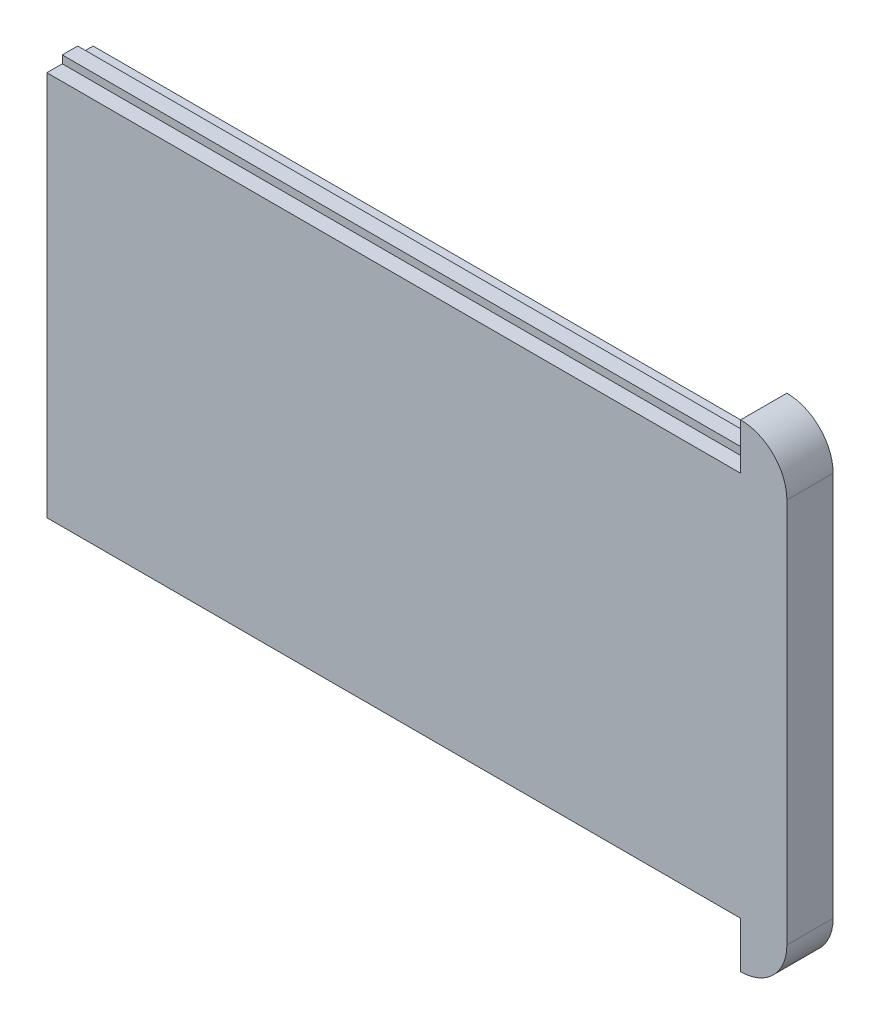
ISO-10303-21;
HEADER;
FILE_DESCRIPTION(('STEP AP214'),'2;1');
FILE_NAME('part.step','',(''),(''),'','','');
FILE_SCHEMA(('AUTOMOTIVE_DESIGN { 1 0 10303 214 1 1 1 1 }'));
ENDSEC;
DATA;
#1=APPLICATION_CONTEXT('core data for automotive mechanical design processes');
#2=APPLICATION_PROTOCOL_DEFINITION('international standard','automotive_design',2000,#1);
#3=PRODUCT_CONTEXT('',#1,'mechanical');
#4=PRODUCT('Part','Part','',(#3));
#5=PRODUCT_RELATED_PRODUCT_CATEGORY('part','',(#4));
#6=PRODUCT_DEFINITION_FORMATION('','',#4);
#7=PRODUCT_DEFINITION_CONTEXT('part definition',#1,'design');
#8=PRODUCT_DEFINITION('design','',#6,#7);
#9=PRODUCT_DEFINITION_SHAPE('','',#8);
#10=(LENGTH_UNIT() NAMED_UNIT(*) SI_UNIT(.MILLI.,.METRE.));
#11=(NAMED_UNIT(*) PLANE_ANGLE_UNIT() SI_UNIT($,.RADIAN.));
#12=(NAMED_UNIT(*) SI_UNIT($,.STERADIAN.) SOLID_ANGLE_UNIT());
#13=UNCERTAINTY_MEASURE_WITH_UNIT(LENGTH_MEASURE(1.E-05),#10,'distance_accuracy_value','');
#14=(GEOMETRIC_REPRESENTATION_CONTEXT(3) GLOBAL_UNCERTAINTY_ASSIGNED_CONTEXT((#13)) GLOBAL_UNIT_ASSIGNED_CONTEXT((#10,
#11,#12)) REPRESENTATION_CONTEXT('',''));
#15=CARTESIAN_POINT('',(0.,0.,0.));
#16=DIRECTION('',(0.,0.,1.));
#17=DIRECTION('',(1.,0.,0.));
#18=AXIS2_PLACEMENT_3D('',#15,#16,#17);
#19=CARTESIAN_POINT('',(-22.5,12.5,3.));
#20=DIRECTION('',(0.,-1.,0.));
#21=DIRECTION('',(0.,0.,-1.));
#22=AXIS2_PLACEMENT_3D('',#19,#20,#21);
#23=PLANE('',#22);
#24=DIRECTION('',(-1.,0.,0.));
#25=VECTOR('',#24,1.);
#26=CARTESIAN_POINT('',(-22.5,12.5,0.));
#27=LINE('',#26,#25);
#28=CARTESIAN_POINT('',(19.5,12.5,0.));
#29=VERTEX_POINT('',#28);
#30=CARTESIAN_POINT('',(-25.5,12.5,0.));
#31=VERTEX_POINT('',#30);
#32=EDGE_CURVE('E165',#29,#31,#27,.T.);
#33=ORIENTED_EDGE('',*,*,#32,.T.);
#34=DIRECTION('',(0.,0.,-1.));
#35=VECTOR('',#34,1.);
#36=CARTESIAN_POINT('',(-25.5,12.5,0.));
#37=LINE('',#36,#35);
#38=CARTESIAN_POINT('',(-25.5,12.5,1.));
#39=VERTEX_POINT('',#38);
#40=EDGE_CURVE('E180',#39,#31,#37,.T.);
#41=ORIENTED_EDGE('',*,*,#40,.F.);
#42=DIRECTION('',(1.,0.,0.));
#43=VECTOR('',#42,1.);
#44=CARTESIAN_POINT('',(-25.5,12.5,1.));
#45=LINE('',#44,#43);
#46=CARTESIAN_POINT('',(19.5,12.5,1.));
#47=VERTEX_POINT('',#46);
#48=EDGE_CURVE('E213',#39,#47,#45,.T.);
#49=ORIENTED_EDGE('',*,*,#48,.T.);
#50=DIRECTION('',(0.,0.,-1.));
#51=VECTOR('',#50,1.);
#52=CARTESIAN_POINT('',(19.5,12.5,3.));
#53=LINE('',#52,#51);
#54=EDGE_CURVE('E242',#47,#29,#53,.T.);
#55=ORIENTED_EDGE('',*,*,#54,.T.);
#56=EDGE_LOOP('',(#33,#41,#49,#55));
#57=FACE_BOUND('',#56,.T.);
#58=ADVANCED_FACE('F38',(#57),#23,.F.);
#59=CARTESIAN_POINT('',(-22.5,-12.5,3.));
#60=DIRECTION('',(0.,1.,0.));
#61=DIRECTION('',(0.,0.,1.));
#62=AXIS2_PLACEMENT_3D('',#59,#60,#61);
#63=PLANE('',#62);
#64=DIRECTION('',(1.,0.,0.));
#65=VECTOR('',#64,1.);
#66=CARTESIAN_POINT('',(-25.5,-12.5,2.));
#67=LINE('',#66,#65);
#68=CARTESIAN_POINT('',(-25.5,-12.5,2.));
#69=VERTEX_POINT('',#68);
#70=CARTESIAN_POINT('',(19.5,-12.5,2.));
#71=VERTEX_POINT('',#70);
#72=EDGE_CURVE('E234',#69,#71,#67,.T.);
#73=ORIENTED_EDGE('',*,*,#72,.T.);
#74=DIRECTION('',(0.,0.,1.));
#75=VECTOR('',#74,1.);
#76=CARTESIAN_POINT('',(19.5,-12.5,3.));
#77=LINE('',#76,#75);
#78=CARTESIAN_POINT('',(19.5,-12.5,3.));
#79=VERTEX_POINT('',#78);
#80=EDGE_CURVE('E250',#71,#79,#77,.T.);
#81=ORIENTED_EDGE('',*,*,#80,.T.);
#82=DIRECTION('',(1.,0.,0.));
#83=VECTOR('',#82,1.);
#84=CARTESIAN_POINT('',(-22.5,-12.5,3.));
#85=LINE('',#84,#83);
#86=CARTESIAN_POINT('',(-25.5,-12.5,3.));
#87=VERTEX_POINT('',#86);
#88=EDGE_CURVE('E263',#87,#79,#85,.T.);
#89=ORIENTED_EDGE('',*,*,#88,.F.);
#90=DIRECTION('',(0.,0.,1.));
#91=VECTOR('',#90,1.);
#92=CARTESIAN_POINT('',(-25.5,-12.5,0.));
#93=LINE('',#92,#91);
#94=EDGE_CURVE('E174',#69,#87,#93,.T.);
#95=ORIENTED_EDGE('',*,*,#94,.F.);
#96=EDGE_LOOP('',(#73,#81,#89,#95));
#97=FACE_BOUND('',#96,.T.);
#98=ADVANCED_FACE('F313',(#97),#63,.F.);
#99=CARTESIAN_POINT('',(19.5,-12.5,0.));
#100=VERTEX_POINT('',#99);
#101=CARTESIAN_POINT('',(19.5,-12.5,1.));
#102=VERTEX_POINT('',#101);
#103=EDGE_CURVE('E251',#100,#102,#77,.T.);
#104=ORIENTED_EDGE('',*,*,#103,.T.);
#105=DIRECTION('',(1.,0.,0.));
#106=VECTOR('',#105,1.);
#107=CARTESIAN_POINT('',(-25.5,-12.5,1.));
#108=LINE('',#107,#106);
#109=CARTESIAN_POINT('',(-25.5,-12.5,1.));
#110=VERTEX_POINT('',#109);
#111=EDGE_CURVE('E171',#110,#102,#108,.T.);
#112=ORIENTED_EDGE('',*,*,#111,.F.);
#113=CARTESIAN_POINT('',(-25.5,-12.5,0.));
#114=VERTEX_POINT('',#113);
#115=EDGE_CURVE('E169',#114,#110,#93,.T.);
#116=ORIENTED_EDGE('',*,*,#115,.F.);
#117=DIRECTION('',(1.,0.,0.));
#118=VECTOR('',#117,1.);
#119=CARTESIAN_POINT('',(-22.5,-12.5,0.));
#120=LINE('',#119,#118);
#121=EDGE_CURVE('E154',#114,#100,#120,.T.);
#122=ORIENTED_EDGE('',*,*,#121,.T.);
#123=EDGE_LOOP('',(#104,#112,#116,#122));
#124=FACE_BOUND('',#123,.T.);
#125=ADVANCED_FACE('F170',(#124),#63,.F.);
#126=CARTESIAN_POINT('',(19.5,0.,0.));
#127=DIRECTION('',(1.,0.,0.));
#128=DIRECTION('',(0.,0.,-1.));
#129=AXIS2_PLACEMENT_3D('',#126,#127,#128);
#130=PLANE('',#129);
#131=DIRECTION('',(0.,1.,0.));
#132=VECTOR('',#131,1.);
#133=CARTESIAN_POINT('',(19.5,0.,2.));
#134=LINE('',#133,#132);
#135=CARTESIAN_POINT('',(19.5,-13.,2.));
#136=VERTEX_POINT('',#135);
#137=EDGE_CURVE('E226',#136,#71,#134,.T.);
#138=ORIENTED_EDGE('',*,*,#137,.F.);
#139=DIRECTION('',(0.,0.,1.));
#140=VECTOR('',#139,1.);
#141=CARTESIAN_POINT('',(19.5,-13.,0.));
#142=LINE('',#141,#140);
#143=CARTESIAN_POINT('',(19.5,-13.,1.));
#144=VERTEX_POINT('',#143);
#145=EDGE_CURVE('E215',#144,#136,#142,.T.);
#146=ORIENTED_EDGE('',*,*,#145,.F.);
#147=DIRECTION('',(0.,-1.,0.));
#148=VECTOR('',#147,1.);
#149=CARTESIAN_POINT('',(19.5,0.,1.));
#150=LINE('',#149,#148);
#151=EDGE_CURVE('E219',#102,#144,#150,.T.);
#152=ORIENTED_EDGE('',*,*,#151,.F.);
#153=ORIENTED_EDGE('',*,*,#103,.F.);
#154=DIRECTION('',(0.,1.,0.));
#155=VECTOR('',#154,1.);
#156=CARTESIAN_POINT('',(19.5,-15.5,0.));
#157=LINE('',#156,#155);
#158=CARTESIAN_POINT('',(19.5,-15.5,0.));
#159=VERTEX_POINT('',#158);
#160=EDGE_CURVE('E161',#159,#100,#157,.T.);
#161=ORIENTED_EDGE('',*,*,#160,.F.);
#162=DIRECTION('',(0.,0.,-1.));
#163=VECTOR('',#162,1.);
#164=CARTESIAN_POINT('',(19.5,-15.5,3.));
#165=LINE('',#164,#163);
#166=CARTESIAN_POINT('',(19.5,-15.5,3.));
#167=VERTEX_POINT('',#166);
#168=EDGE_CURVE('E255',#167,#159,#165,.T.);
#169=ORIENTED_EDGE('',*,*,#168,.F.);
#170=DIRECTION('',(0.,-1.,0.));
#171=VECTOR('',#170,1.);
#172=CARTESIAN_POINT('',(19.5,-12.5,3.));
#173=LINE('',#172,#171);
#174=EDGE_CURVE('E253',#79,#167,#173,.T.);
#175=ORIENTED_EDGE('',*,*,#174,.F.);
#176=ORIENTED_EDGE('',*,*,#80,.F.);
#177=EDGE_LOOP('',(#138,#146,#152,#153,#161,#169,#175,#176));
#178=FACE_BOUND('',#177,.T.);
#179=ADVANCED_FACE('F279',(#178),#130,.F.);
#180=CARTESIAN_POINT('',(22.5,12.5,3.));
#181=DIRECTION('',(-1.,0.,0.));
#182=DIRECTION('',(0.,-1.,0.));
#183=AXIS2_PLACEMENT_3D('',#180,#181,#182);
#184=PLANE('',#183);
#185=DIRECTION('',(0.,1.,0.));
#186=VECTOR('',#185,1.);
#187=CARTESIAN_POINT('',(22.5,12.5,0.));
#188=LINE('',#187,#186);
#189=CARTESIAN_POINT('',(22.5,-12.5,0.));
#190=VERTEX_POINT('',#189);
#191=CARTESIAN_POINT('',(22.5,12.5,0.));
#192=VERTEX_POINT('',#191);
#193=EDGE_CURVE('E259',#190,#192,#188,.T.);
#194=ORIENTED_EDGE('',*,*,#193,.T.);
#195=DIRECTION('',(0.,0.,1.));
#196=VECTOR('',#195,1.);
#197=CARTESIAN_POINT('',(22.5,12.5,3.));
#198=LINE('',#197,#196);
#199=CARTESIAN_POINT('',(22.5,12.5,3.));
#200=VERTEX_POINT('',#199);
#201=EDGE_CURVE('E272',#192,#200,#198,.T.);
#202=ORIENTED_EDGE('',*,*,#201,.T.);
#203=DIRECTION('',(0.,1.,0.));
#204=VECTOR('',#203,1.);
#205=CARTESIAN_POINT('',(22.5,12.5,3.));
#206=LINE('',#205,#204);
#207=CARTESIAN_POINT('',(22.5,-12.5,3.));
#208=VERTEX_POINT('',#207);
#209=EDGE_CURVE('E164',#208,#200,#206,.T.);
#210=ORIENTED_EDGE('',*,*,#209,.F.);
#211=DIRECTION('',(0.,0.,-1.));
#212=VECTOR('',#211,1.);
#213=CARTESIAN_POINT('',(22.5,-12.5,0.));
#214=LINE('',#213,#212);
#215=EDGE_CURVE('E266',#208,#190,#214,.T.);
#216=ORIENTED_EDGE('',*,*,#215,.T.);
#217=EDGE_LOOP('',(#194,#202,#210,#216));
#218=FACE_BOUND('',#217,.T.);
#219=ADVANCED_FACE('F283',(#218),#184,.F.);
#220=CARTESIAN_POINT('',(19.5,12.5,3.));
#221=VERTEX_POINT('',#220);
#222=CARTESIAN_POINT('',(19.5,12.5,2.));
#223=VERTEX_POINT('',#222);
#224=EDGE_CURVE('E243',#221,#223,#53,.T.);
#225=ORIENTED_EDGE('',*,*,#224,.T.);
#226=DIRECTION('',(1.,0.,0.));
#227=VECTOR('',#226,1.);
#228=CARTESIAN_POINT('',(-25.5,12.5,2.));
#229=LINE('',#228,#227);
#230=CARTESIAN_POINT('',(-25.5,12.5,2.));
#231=VERTEX_POINT('',#230);
#232=EDGE_CURVE('E211',#231,#223,#229,.T.);
#233=ORIENTED_EDGE('',*,*,#232,.F.);
#234=CARTESIAN_POINT('',(-25.5,12.5,3.));
#235=VERTEX_POINT('',#234);
#236=EDGE_CURVE('E186',#235,#231,#37,.T.);
#237=ORIENTED_EDGE('',*,*,#236,.F.);
#238=DIRECTION('',(-1.,0.,0.));
#239=VECTOR('',#238,1.);
#240=CARTESIAN_POINT('',(-22.5,12.5,3.));
#241=LINE('',#240,#239);
#242=EDGE_CURVE('E261',#221,#235,#241,.T.);
#243=ORIENTED_EDGE('',*,*,#242,.F.);
#244=EDGE_LOOP('',(#225,#233,#237,#243));
#245=FACE_BOUND('',#244,.T.);
#246=ADVANCED_FACE('F306',(#245),#23,.F.);
#247=CARTESIAN_POINT('',(0.,0.,3.));
#248=DIRECTION('',(0.,0.,1.));
#249=DIRECTION('',(1.,0.,0.));
#250=AXIS2_PLACEMENT_3D('',#247,#248,#249);
#251=PLANE('',#250);
#252=ORIENTED_EDGE('',*,*,#209,.T.);
#253=CARTESIAN_POINT('',(19.5,12.5,3.));
#254=DIRECTION('',(0.,0.,1.));
#255=DIRECTION('',(1.,0.,0.));
#256=AXIS2_PLACEMENT_3D('',#253,#254,#255);
#257=CIRCLE('',#256,3.);
#258=CARTESIAN_POINT('',(19.5,15.5,3.));
#259=VERTEX_POINT('',#258);
#260=EDGE_CURVE('E53',#200,#259,#257,.T.);
#261=ORIENTED_EDGE('',*,*,#260,.T.);
#262=DIRECTION('',(0.,-1.,0.));
#263=VECTOR('',#262,1.);
#264=CARTESIAN_POINT('',(19.5,15.5,3.));
#265=LINE('',#264,#263);
#266=EDGE_CURVE('E239',#259,#221,#265,.T.);
#267=ORIENTED_EDGE('',*,*,#266,.T.);
#268=ORIENTED_EDGE('',*,*,#242,.T.);
#269=DIRECTION('',(0.,1.,0.));
#270=VECTOR('',#269,1.);
#271=CARTESIAN_POINT('',(-25.5,12.5,3.));
#272=LINE('',#271,#270);
#273=EDGE_CURVE('E173',#87,#235,#272,.T.);
#274=ORIENTED_EDGE('',*,*,#273,.F.);
#275=ORIENTED_EDGE('',*,*,#88,.T.);
#276=ORIENTED_EDGE('',*,*,#174,.T.);
#277=CARTESIAN_POINT('',(19.5,-12.5,3.));
#278=DIRECTION('',(0.,0.,1.));
#279=DIRECTION('',(1.,0.,0.));
#280=AXIS2_PLACEMENT_3D('',#277,#278,#279);
#281=CIRCLE('',#280,3.);
#282=EDGE_CURVE('E61',#167,#208,#281,.T.);
#283=ORIENTED_EDGE('',*,*,#282,.T.);
#284=EDGE_LOOP('',(#252,#261,#267,#268,#274,#275,#276,#283));
#285=FACE_BOUND('',#284,.T.);
#286=ADVANCED_FACE('F284',(#285),#251,.T.);
#287=CARTESIAN_POINT('',(0.,0.,0.));
#288=DIRECTION('',(0.,0.,1.));
#289=DIRECTION('',(1.,0.,0.));
#290=AXIS2_PLACEMENT_3D('',#287,#288,#289);
#291=PLANE('',#290);
#292=DIRECTION('',(0.,1.,0.));
#293=VECTOR('',#292,1.);
#294=CARTESIAN_POINT('',(19.5,12.5,0.));
#295=LINE('',#294,#293);
#296=CARTESIAN_POINT('',(19.5,15.5,0.));
#297=VERTEX_POINT('',#296);
#298=EDGE_CURVE('E246',#29,#297,#295,.T.);
#299=ORIENTED_EDGE('',*,*,#298,.T.);
#300=CARTESIAN_POINT('',(19.5,12.5,0.));
#301=DIRECTION('',(0.,0.,1.));
#302=DIRECTION('',(1.,0.,0.));
#303=AXIS2_PLACEMENT_3D('',#300,#301,#302);
#304=CIRCLE('',#303,3.);
#305=EDGE_CURVE('E11',#297,#192,#304,.F.);
#306=ORIENTED_EDGE('',*,*,#305,.T.);
#307=ORIENTED_EDGE('',*,*,#193,.F.);
#308=CARTESIAN_POINT('',(19.5,-12.5,0.));
#309=DIRECTION('',(0.,0.,1.));
#310=DIRECTION('',(1.,0.,0.));
#311=AXIS2_PLACEMENT_3D('',#308,#309,#310);
#312=CIRCLE('',#311,3.);
#313=EDGE_CURVE('E46',#190,#159,#312,.F.);
#314=ORIENTED_EDGE('',*,*,#313,.T.);
#315=ORIENTED_EDGE('',*,*,#160,.T.);
#316=ORIENTED_EDGE('',*,*,#121,.F.);
#317=DIRECTION('',(0.,-1.,0.));
#318=VECTOR('',#317,1.);
#319=CARTESIAN_POINT('',(-25.5,12.5,0.));
#320=LINE('',#319,#318);
#321=EDGE_CURVE('E159',#31,#114,#320,.T.);
#322=ORIENTED_EDGE('',*,*,#321,.F.);
#323=ORIENTED_EDGE('',*,*,#32,.F.);
#324=EDGE_LOOP('',(#299,#306,#307,#314,#315,#316,#322,#323));
#325=FACE_BOUND('',#324,.T.);
#326=ADVANCED_FACE('F156',(#325),#291,.F.);
#327=CARTESIAN_POINT('',(19.5,0.,0.));
#328=DIRECTION('',(1.,0.,0.));
#329=DIRECTION('',(0.,0.,-1.));
#330=AXIS2_PLACEMENT_3D('',#327,#328,#329);
#331=PLANE('',#330);
#332=ORIENTED_EDGE('',*,*,#54,.F.);
#333=DIRECTION('',(0.,1.,0.));
#334=VECTOR('',#333,1.);
#335=CARTESIAN_POINT('',(19.5,0.,1.));
#336=LINE('',#335,#334);
#337=CARTESIAN_POINT('',(19.5,13.,1.));
#338=VERTEX_POINT('',#337);
#339=EDGE_CURVE('E189',#47,#338,#336,.T.);
#340=ORIENTED_EDGE('',*,*,#339,.T.);
#341=DIRECTION('',(0.,0.,1.));
#342=VECTOR('',#341,1.);
#343=CARTESIAN_POINT('',(19.5,13.,0.));
#344=LINE('',#343,#342);
#345=CARTESIAN_POINT('',(19.5,13.,2.));
#346=VERTEX_POINT('',#345);
#347=EDGE_CURVE('E194',#338,#346,#344,.T.);
#348=ORIENTED_EDGE('',*,*,#347,.T.);
#349=DIRECTION('',(0.,-1.,0.));
#350=VECTOR('',#349,1.);
#351=CARTESIAN_POINT('',(19.5,0.,2.));
#352=LINE('',#351,#350);
#353=EDGE_CURVE('E202',#346,#223,#352,.T.);
#354=ORIENTED_EDGE('',*,*,#353,.T.);
#355=ORIENTED_EDGE('',*,*,#224,.F.);
#356=ORIENTED_EDGE('',*,*,#266,.F.);
#357=DIRECTION('',(0.,0.,1.));
#358=VECTOR('',#357,1.);
#359=CARTESIAN_POINT('',(19.5,15.5,0.));
#360=LINE('',#359,#358);
#361=EDGE_CURVE('E248',#297,#259,#360,.T.);
#362=ORIENTED_EDGE('',*,*,#361,.F.);
#363=ORIENTED_EDGE('',*,*,#298,.F.);
#364=EDGE_LOOP('',(#332,#340,#348,#354,#355,#356,#362,#363));
#365=FACE_BOUND('',#364,.T.);
#366=ADVANCED_FACE('F290',(#365),#331,.F.);
#367=CARTESIAN_POINT('',(-25.5,-13.,0.));
#368=DIRECTION('',(0.,1.,0.));
#369=DIRECTION('',(0.,0.,1.));
#370=AXIS2_PLACEMENT_3D('',#367,#368,#369);
#371=PLANE('',#370);
#372=ORIENTED_EDGE('',*,*,#145,.T.);
#373=DIRECTION('',(1.,0.,0.));
#374=VECTOR('',#373,1.);
#375=CARTESIAN_POINT('',(-25.5,-13.,2.));
#376=LINE('',#375,#374);
#377=CARTESIAN_POINT('',(-25.5,-13.,2.));
#378=VERTEX_POINT('',#377);
#379=EDGE_CURVE('E236',#378,#136,#376,.T.);
#380=ORIENTED_EDGE('',*,*,#379,.F.);
#381=DIRECTION('',(0.,0.,1.));
#382=VECTOR('',#381,1.);
#383=CARTESIAN_POINT('',(-25.5,-13.,0.));
#384=LINE('',#383,#382);
#385=CARTESIAN_POINT('',(-25.5,-13.,1.));
#386=VERTEX_POINT('',#385);
#387=EDGE_CURVE('E216',#386,#378,#384,.T.);
#388=ORIENTED_EDGE('',*,*,#387,.F.);
#389=DIRECTION('',(1.,0.,0.));
#390=VECTOR('',#389,1.);
#391=CARTESIAN_POINT('',(-25.5,-13.,1.));
#392=LINE('',#391,#390);
#393=EDGE_CURVE('E223',#386,#144,#392,.T.);
#394=ORIENTED_EDGE('',*,*,#393,.T.);
#395=EDGE_LOOP('',(#372,#380,#388,#394));
#396=FACE_BOUND('',#395,.T.);
#397=ADVANCED_FACE('F320',(#396),#371,.F.);
#398=CARTESIAN_POINT('',(-25.5,0.,2.));
#399=DIRECTION('',(0.,0.,-1.));
#400=DIRECTION('',(-1.,0.,0.));
#401=AXIS2_PLACEMENT_3D('',#398,#399,#400);
#402=PLANE('',#401);
#403=ORIENTED_EDGE('',*,*,#137,.T.);
#404=ORIENTED_EDGE('',*,*,#72,.F.);
#405=DIRECTION('',(0.,1.,0.));
#406=VECTOR('',#405,1.);
#407=CARTESIAN_POINT('',(-25.5,0.,2.));
#408=LINE('',#407,#406);
#409=EDGE_CURVE('E218',#378,#69,#408,.T.);
#410=ORIENTED_EDGE('',*,*,#409,.F.);
#411=ORIENTED_EDGE('',*,*,#379,.T.);
#412=EDGE_LOOP('',(#403,#404,#410,#411));
#413=FACE_BOUND('',#412,.T.);
#414=ADVANCED_FACE('F316',(#413),#402,.F.);
#415=CARTESIAN_POINT('',(-25.5,0.,1.));
#416=DIRECTION('',(0.,0.,1.));
#417=DIRECTION('',(1.,0.,0.));
#418=AXIS2_PLACEMENT_3D('',#415,#416,#417);
#419=PLANE('',#418);
#420=ORIENTED_EDGE('',*,*,#151,.T.);
#421=ORIENTED_EDGE('',*,*,#393,.F.);
#422=DIRECTION('',(0.,-1.,0.));
#423=VECTOR('',#422,1.);
#424=CARTESIAN_POINT('',(-25.5,0.,1.));
#425=LINE('',#424,#423);
#426=EDGE_CURVE('E221',#110,#386,#425,.T.);
#427=ORIENTED_EDGE('',*,*,#426,.F.);
#428=ORIENTED_EDGE('',*,*,#111,.T.);
#429=EDGE_LOOP('',(#420,#421,#427,#428));
#430=FACE_BOUND('',#429,.T.);
#431=ADVANCED_FACE('F323',(#430),#419,.F.);
#432=CARTESIAN_POINT('',(-25.5,0.,0.));
#433=DIRECTION('',(-1.,0.,0.));
#434=DIRECTION('',(0.,0.,1.));
#435=AXIS2_PLACEMENT_3D('',#432,#433,#434);
#436=PLANE('',#435);
#437=ORIENTED_EDGE('',*,*,#387,.T.);
#438=ORIENTED_EDGE('',*,*,#409,.T.);
#439=ORIENTED_EDGE('',*,*,#94,.T.);
#440=ORIENTED_EDGE('',*,*,#273,.T.);
#441=ORIENTED_EDGE('',*,*,#236,.T.);
#442=DIRECTION('',(0.,-1.,0.));
#443=VECTOR('',#442,1.);
#444=CARTESIAN_POINT('',(-25.5,0.,2.));
#445=LINE('',#444,#443);
#446=CARTESIAN_POINT('',(-25.5,13.,2.));
#447=VERTEX_POINT('',#446);
#448=EDGE_CURVE('E193',#447,#231,#445,.T.);
#449=ORIENTED_EDGE('',*,*,#448,.F.);
#450=DIRECTION('',(0.,0.,1.));
#451=VECTOR('',#450,1.);
#452=CARTESIAN_POINT('',(-25.5,13.,0.));
#453=LINE('',#452,#451);
#454=CARTESIAN_POINT('',(-25.5,13.,1.));
#455=VERTEX_POINT('',#454);
#456=EDGE_CURVE('E196',#455,#447,#453,.T.);
#457=ORIENTED_EDGE('',*,*,#456,.F.);
#458=DIRECTION('',(0.,1.,0.));
#459=VECTOR('',#458,1.);
#460=CARTESIAN_POINT('',(-25.5,0.,1.));
#461=LINE('',#460,#459);
#462=EDGE_CURVE('E190',#39,#455,#461,.T.);
#463=ORIENTED_EDGE('',*,*,#462,.F.);
#464=ORIENTED_EDGE('',*,*,#40,.T.);
#465=ORIENTED_EDGE('',*,*,#321,.T.);
#466=ORIENTED_EDGE('',*,*,#115,.T.);
#467=ORIENTED_EDGE('',*,*,#426,.T.);
#468=EDGE_LOOP('',(#437,#438,#439,#440,#441,#449,#457,#463,#464,#465,#466,#467));
#469=FACE_BOUND('',#468,.T.);
#470=ADVANCED_FACE('F178',(#469),#436,.T.);
#471=CARTESIAN_POINT('',(-25.5,0.,1.));
#472=DIRECTION('',(0.,0.,-1.));
#473=DIRECTION('',(-1.,0.,0.));
#474=AXIS2_PLACEMENT_3D('',#471,#472,#473);
#475=PLANE('',#474);
#476=ORIENTED_EDGE('',*,*,#339,.F.);
#477=ORIENTED_EDGE('',*,*,#48,.F.);
#478=ORIENTED_EDGE('',*,*,#462,.T.);
#479=DIRECTION('',(1.,0.,0.));
#480=VECTOR('',#479,1.);
#481=CARTESIAN_POINT('',(-25.5,13.,1.));
#482=LINE('',#481,#480);
#483=EDGE_CURVE('E199',#455,#338,#482,.T.);
#484=ORIENTED_EDGE('',*,*,#483,.T.);
#485=EDGE_LOOP('',(#476,#477,#478,#484));
#486=FACE_BOUND('',#485,.T.);
#487=ADVANCED_FACE('F298',(#486),#475,.T.);
#488=CARTESIAN_POINT('',(-25.5,0.,2.));
#489=DIRECTION('',(0.,0.,1.));
#490=DIRECTION('',(1.,0.,0.));
#491=AXIS2_PLACEMENT_3D('',#488,#489,#490);
#492=PLANE('',#491);
#493=ORIENTED_EDGE('',*,*,#353,.F.);
#494=DIRECTION('',(1.,0.,0.));
#495=VECTOR('',#494,1.);
#496=CARTESIAN_POINT('',(-25.5,13.,2.));
#497=LINE('',#496,#495);
#498=EDGE_CURVE('E208',#447,#346,#497,.T.);
#499=ORIENTED_EDGE('',*,*,#498,.F.);
#500=ORIENTED_EDGE('',*,*,#448,.T.);
#501=ORIENTED_EDGE('',*,*,#232,.T.);
#502=EDGE_LOOP('',(#493,#499,#500,#501));
#503=FACE_BOUND('',#502,.T.);
#504=ADVANCED_FACE('F354',(#503),#492,.T.);
#505=CARTESIAN_POINT('',(-25.5,13.,0.));
#506=DIRECTION('',(0.,1.,0.));
#507=DIRECTION('',(0.,0.,1.));
#508=AXIS2_PLACEMENT_3D('',#505,#506,#507);
#509=PLANE('',#508);
#510=ORIENTED_EDGE('',*,*,#347,.F.);
#511=ORIENTED_EDGE('',*,*,#483,.F.);
#512=ORIENTED_EDGE('',*,*,#456,.T.);
#513=ORIENTED_EDGE('',*,*,#498,.T.);
#514=EDGE_LOOP('',(#510,#511,#512,#513));
#515=FACE_BOUND('',#514,.T.);
#516=ADVANCED_FACE('F302',(#515),#509,.T.);
#517=CARTESIAN_POINT('',(19.5,12.5,3.));
#518=DIRECTION('',(0.,0.,-1.));
#519=DIRECTION('',(-1.,0.,0.));
#520=AXIS2_PLACEMENT_3D('',#517,#518,#519);
#521=CYLINDRICAL_SURFACE('',#520,3.);
#522=ORIENTED_EDGE('',*,*,#305,.F.);
#523=ORIENTED_EDGE('',*,*,#361,.T.);
#524=ORIENTED_EDGE('',*,*,#260,.F.);
#525=ORIENTED_EDGE('',*,*,#201,.F.);
#526=EDGE_LOOP('',(#522,#523,#524,#525));
#527=FACE_BOUND('',#526,.T.);
#528=ADVANCED_FACE('F293',(#527),#521,.T.);
#529=CARTESIAN_POINT('',(19.5,-12.5,3.));
#530=DIRECTION('',(0.,0.,1.));
#531=DIRECTION('',(1.,0.,0.));
#532=AXIS2_PLACEMENT_3D('',#529,#530,#531);
#533=CYLINDRICAL_SURFACE('',#532,3.);
#534=ORIENTED_EDGE('',*,*,#282,.F.);
#535=ORIENTED_EDGE('',*,*,#168,.T.);
#536=ORIENTED_EDGE('',*,*,#313,.F.);
#537=ORIENTED_EDGE('',*,*,#215,.F.);
#538=EDGE_LOOP('',(#534,#535,#536,#537));
#539=FACE_BOUND('',#538,.T.);
#540=ADVANCED_FACE('F40',(#539),#533,.T.);
#541=CLOSED_SHELL('',(#58,#98,#125,#179,#219,#246,#286,#326,#366,#397,#414,#431,#470,#487,#504,
#516,#528,#540));
#542=MANIFOLD_SOLID_BREP('B2',#541);
#543=ADVANCED_BREP_SHAPE_REPRESENTATION('',(#18,#542),#14);
#544=SHAPE_DEFINITION_REPRESENTATION(#9,#543);
ENDSEC;
END-ISO-10303-21;
